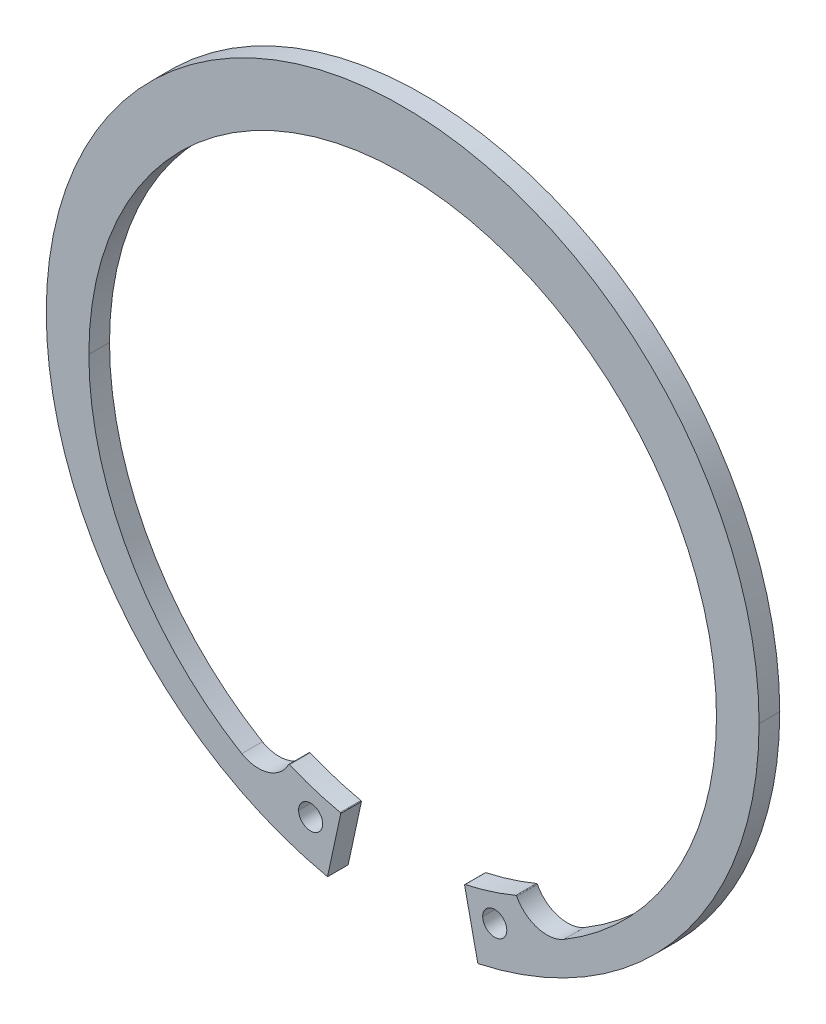
ISO-10303-21;
HEADER;
FILE_DESCRIPTION(('STEP AP214'),'2;1');
FILE_NAME('part.step','',(''),(''),'','','');
FILE_SCHEMA(('AUTOMOTIVE_DESIGN { 1 0 10303 214 1 1 1 1 }'));
ENDSEC;
DATA;
#1=APPLICATION_CONTEXT('core data for automotive mechanical design processes');
#2=APPLICATION_PROTOCOL_DEFINITION('international standard','automotive_design',2000,#1);
#3=PRODUCT_CONTEXT('',#1,'mechanical');
#4=PRODUCT('Part','Part','',(#3));
#5=PRODUCT_RELATED_PRODUCT_CATEGORY('part','',(#4));
#6=PRODUCT_DEFINITION_FORMATION('','',#4);
#7=PRODUCT_DEFINITION_CONTEXT('part definition',#1,'design');
#8=PRODUCT_DEFINITION('design','',#6,#7);
#9=PRODUCT_DEFINITION_SHAPE('','',#8);
#10=(LENGTH_UNIT() NAMED_UNIT(*) SI_UNIT(.MILLI.,.METRE.));
#11=(NAMED_UNIT(*) PLANE_ANGLE_UNIT() SI_UNIT($,.RADIAN.));
#12=(NAMED_UNIT(*) SI_UNIT($,.STERADIAN.) SOLID_ANGLE_UNIT());
#13=UNCERTAINTY_MEASURE_WITH_UNIT(LENGTH_MEASURE(1.E-05),#10,'distance_accuracy_value','');
#14=(GEOMETRIC_REPRESENTATION_CONTEXT(3) GLOBAL_UNCERTAINTY_ASSIGNED_CONTEXT((#13)) GLOBAL_UNIT_ASSIGNED_CONTEXT((#10,
#11,#12)) REPRESENTATION_CONTEXT('',''));
#15=CARTESIAN_POINT('',(0.,0.,0.));
#16=DIRECTION('',(0.,0.,1.));
#17=DIRECTION('',(1.,0.,0.));
#18=AXIS2_PLACEMENT_3D('',#15,#16,#17);
#19=CARTESIAN_POINT('',(-9.091747982708,-41.6696846474619,-3.));
#20=DIRECTION('',(0.,0.,1.));
#21=DIRECTION('',(1.,0.,0.));
#22=AXIS2_PLACEMENT_3D('',#19,#20,#21);
#23=CYLINDRICAL_SURFACE('',#22,0.100000000000005);
#24=DIRECTION('',(0.,0.,1.));
#25=VECTOR('',#24,1.);
#26=CARTESIAN_POINT('',(-8.99174798270799,-41.6696846474619,-3.));
#27=LINE('',#26,#25);
#28=CARTESIAN_POINT('',(-8.99174798270799,-41.6696846474619,-3.));
#29=VERTEX_POINT('',#28);
#30=CARTESIAN_POINT('',(-8.99174798270799,-41.6696846474619,0.));
#31=VERTEX_POINT('',#30);
#32=EDGE_CURVE('E289',#29,#31,#27,.T.);
#33=ORIENTED_EDGE('',*,*,#32,.F.);
#34=CARTESIAN_POINT('',(-9.091747982708,-41.6696846474619,-3.));
#35=DIRECTION('',(0.,0.,1.));
#36=DIRECTION('',(-1.,0.,0.));
#37=AXIS2_PLACEMENT_3D('',#34,#35,#36);
#38=CIRCLE('',#37,0.100000000000005);
#39=CARTESIAN_POINT('',(-9.07043087137691,-41.5719831594257,-3.));
#40=VERTEX_POINT('',#39);
#41=EDGE_CURVE('E321',#29,#40,#38,.T.);
#42=ORIENTED_EDGE('',*,*,#41,.T.);
#43=DIRECTION('',(0.,0.,1.));
#44=VECTOR('',#43,1.);
#45=CARTESIAN_POINT('',(-9.07043087137691,-41.5719831594257,-3.));
#46=LINE('',#45,#44);
#47=CARTESIAN_POINT('',(-9.07043087137691,-41.5719831594257,0.));
#48=VERTEX_POINT('',#47);
#49=EDGE_CURVE('E79',#40,#48,#46,.T.);
#50=ORIENTED_EDGE('',*,*,#49,.T.);
#51=CARTESIAN_POINT('',(-9.091747982708,-41.6696846474619,0.));
#52=DIRECTION('',(0.,0.,1.));
#53=DIRECTION('',(-1.,0.,0.));
#54=AXIS2_PLACEMENT_3D('',#51,#52,#53);
#55=CIRCLE('',#54,0.100000000000005);
#56=EDGE_CURVE('E273',#31,#48,#55,.T.);
#57=ORIENTED_EDGE('',*,*,#56,.F.);
#58=EDGE_LOOP('',(#33,#42,#50,#57));
#59=FACE_BOUND('',#58,.T.);
#60=ADVANCED_FACE('F17',(#59),#23,.T.);
#61=CARTESIAN_POINT('',(-16.4700937179461,-39.3415621566057,-3.));
#62=DIRECTION('',(0.,0.,1.));
#63=DIRECTION('',(1.,0.,0.));
#64=AXIS2_PLACEMENT_3D('',#61,#62,#63);
#65=CYLINDRICAL_SURFACE('',#64,0.100000000000024);
#66=CARTESIAN_POINT('',(-16.4700937179461,-39.3415621566057,0.));
#67=DIRECTION('',(0.,0.,1.));
#68=DIRECTION('',(1.,0.,0.));
#69=AXIS2_PLACEMENT_3D('',#66,#67,#68);
#70=CIRCLE('',#69,0.100000000000024);
#71=CARTESIAN_POINT('',(-16.431476851081,-39.2493193379502,0.));
#72=VERTEX_POINT('',#71);
#73=CARTESIAN_POINT('',(-16.5590059803512,-39.2957952515979,0.));
#74=VERTEX_POINT('',#73);
#75=EDGE_CURVE('E350',#72,#74,#70,.T.);
#76=ORIENTED_EDGE('',*,*,#75,.F.);
#77=DIRECTION('',(0.,0.,1.));
#78=VECTOR('',#77,1.);
#79=CARTESIAN_POINT('',(-16.431476851081,-39.2493193379502,-3.));
#80=LINE('',#79,#78);
#81=CARTESIAN_POINT('',(-16.431476851081,-39.2493193379502,-3.));
#82=VERTEX_POINT('',#81);
#83=EDGE_CURVE('E246',#82,#72,#80,.T.);
#84=ORIENTED_EDGE('',*,*,#83,.F.);
#85=CARTESIAN_POINT('',(-16.4700937179461,-39.3415621566057,-3.));
#86=DIRECTION('',(0.,0.,1.));
#87=DIRECTION('',(1.,0.,0.));
#88=AXIS2_PLACEMENT_3D('',#85,#86,#87);
#89=CIRCLE('',#88,0.100000000000024);
#90=CARTESIAN_POINT('',(-16.5590059803512,-39.2957952515979,-3.));
#91=VERTEX_POINT('',#90);
#92=EDGE_CURVE('E279',#82,#91,#89,.T.);
#93=ORIENTED_EDGE('',*,*,#92,.T.);
#94=DIRECTION('',(0.,0.,1.));
#95=VECTOR('',#94,1.);
#96=CARTESIAN_POINT('',(-16.5590059803512,-39.2957952515979,-3.));
#97=LINE('',#96,#95);
#98=EDGE_CURVE('E11',#91,#74,#97,.T.);
#99=ORIENTED_EDGE('',*,*,#98,.T.);
#100=EDGE_LOOP('',(#76,#84,#93,#99));
#101=FACE_BOUND('',#100,.T.);
#102=ADVANCED_FACE('F470',(#101),#65,.T.);
#103=CARTESIAN_POINT('',(-20.9412112612874,-37.0400887000845,-3.));
#104=DIRECTION('',(0.,0.,1.));
#105=DIRECTION('',(1.,0.,0.));
#106=AXIS2_PLACEMENT_3D('',#103,#104,#105);
#107=CYLINDRICAL_SURFACE('',#106,4.92868493320537);
#108=CARTESIAN_POINT('',(-20.9412112612874,-37.0400887000845,0.));
#109=DIRECTION('',(0.,0.,-1.));
#110=DIRECTION('',(1.,0.,0.));
#111=AXIS2_PLACEMENT_3D('',#108,#109,#110);
#112=CIRCLE('',#111,4.92868493320537);
#113=CARTESIAN_POINT('',(-23.3668900492212,-41.3305452711937,0.));
#114=VERTEX_POINT('',#113);
#115=EDGE_CURVE('E345',#74,#114,#112,.T.);
#116=ORIENTED_EDGE('',*,*,#115,.F.);
#117=ORIENTED_EDGE('',*,*,#98,.F.);
#118=CARTESIAN_POINT('',(-20.9412112612874,-37.0400887000845,-3.));
#119=DIRECTION('',(0.,0.,-1.));
#120=DIRECTION('',(1.,0.,0.));
#121=AXIS2_PLACEMENT_3D('',#118,#119,#120);
#122=CIRCLE('',#121,4.92868493320537);
#123=CARTESIAN_POINT('',(-23.3668900492212,-41.3305452711937,-3.));
#124=VERTEX_POINT('',#123);
#125=EDGE_CURVE('E283',#91,#124,#122,.T.);
#126=ORIENTED_EDGE('',*,*,#125,.T.);
#127=DIRECTION('',(0.,0.,1.));
#128=VECTOR('',#127,1.);
#129=CARTESIAN_POINT('',(-23.3668900492212,-41.3305452711937,-3.));
#130=LINE('',#129,#128);
#131=EDGE_CURVE('E28',#124,#114,#130,.T.);
#132=ORIENTED_EDGE('',*,*,#131,.T.);
#133=EDGE_LOOP('',(#116,#117,#126,#132));
#134=FACE_BOUND('',#133,.T.);
#135=ADVANCED_FACE('F480',(#134),#107,.F.);
#136=CARTESIAN_POINT('',(-25.4690407231875,-45.0487565271298,-3.));
#137=DIRECTION('',(-0.870507372504924,0.492155376293477,0.));
#138=DIRECTION('',(0.,0.,1.));
#139=AXIS2_PLACEMENT_3D('',#136,#137,#138);
#140=PLANE('',#139);
#141=DIRECTION('',(-0.492155376293477,-0.870507372504924,0.));
#142=VECTOR('',#141,1.);
#143=CARTESIAN_POINT('',(-25.4690407231875,-45.0487565271298,-3.));
#144=LINE('',#143,#142);
#145=CARTESIAN_POINT('',(-23.3676688865363,-41.3319228516437,-3.));
#146=VERTEX_POINT('',#145);
#147=EDGE_CURVE('E392',#124,#146,#144,.T.);
#148=ORIENTED_EDGE('',*,*,#147,.T.);
#149=DIRECTION('',(0.,0.,1.));
#150=VECTOR('',#149,1.);
#151=CARTESIAN_POINT('',(-23.3676688865363,-41.3319228516437,-3.));
#152=LINE('',#151,#150);
#153=CARTESIAN_POINT('',(-23.3676688865363,-41.3319228516437,0.));
#154=VERTEX_POINT('',#153);
#155=EDGE_CURVE('E254',#146,#154,#152,.T.);
#156=ORIENTED_EDGE('',*,*,#155,.T.);
#157=DIRECTION('',(-0.492155376293477,-0.870507372504924,0.));
#158=VECTOR('',#157,1.);
#159=CARTESIAN_POINT('',(-25.4690407231875,-45.0487565271298,0.));
#160=LINE('',#159,#158);
#161=EDGE_CURVE('E225',#114,#154,#160,.T.);
#162=ORIENTED_EDGE('',*,*,#161,.F.);
#163=ORIENTED_EDGE('',*,*,#131,.F.);
#164=EDGE_LOOP('',(#148,#156,#162,#163));
#165=FACE_BOUND('',#164,.T.);
#166=ADVANCED_FACE('F965',(#165),#140,.T.);
#167=CARTESIAN_POINT('',(0.,0.,-3.));
#168=DIRECTION('',(0.,0.,1.));
#169=DIRECTION('',(1.,0.,0.));
#170=AXIS2_PLACEMENT_3D('',#167,#168,#169);
#171=CYLINDRICAL_SURFACE('',#170,42.55);
#172=CARTESIAN_POINT('',(0.,0.,0.));
#173=DIRECTION('',(0.,0.,-1.));
#174=DIRECTION('',(1.,0.,0.));
#175=AXIS2_PLACEMENT_3D('',#172,#173,#174);
#176=CIRCLE('',#175,42.55);
#177=EDGE_CURVE('E277',#48,#72,#176,.T.);
#178=ORIENTED_EDGE('',*,*,#177,.F.);
#179=ORIENTED_EDGE('',*,*,#49,.F.);
#180=CARTESIAN_POINT('',(0.,0.,-3.));
#181=DIRECTION('',(0.,0.,-1.));
#182=DIRECTION('',(1.,0.,0.));
#183=AXIS2_PLACEMENT_3D('',#180,#181,#182);
#184=CIRCLE('',#183,42.55);
#185=EDGE_CURVE('E282',#40,#82,#184,.T.);
#186=ORIENTED_EDGE('',*,*,#185,.T.);
#187=ORIENTED_EDGE('',*,*,#83,.T.);
#188=EDGE_LOOP('',(#178,#179,#186,#187));
#189=FACE_BOUND('',#188,.T.);
#190=ADVANCED_FACE('F474',(#189),#171,.F.);
#191=CARTESIAN_POINT('',(23.3668900492212,-41.3305452711937,-3.));
#192=DIRECTION('',(0.870507372504924,0.492155376293477,0.));
#193=DIRECTION('',(0.,0.,-1.));
#194=AXIS2_PLACEMENT_3D('',#191,#192,#193);
#195=PLANE('',#194);
#196=DIRECTION('',(-0.492155376293477,0.870507372504924,0.));
#197=VECTOR('',#196,1.);
#198=CARTESIAN_POINT('',(23.3668900492212,-41.3305452711937,0.));
#199=LINE('',#198,#197);
#200=CARTESIAN_POINT('',(23.3676688865363,-41.3319228516437,0.));
#201=VERTEX_POINT('',#200);
#202=CARTESIAN_POINT('',(23.3668900492212,-41.3305452711937,0.));
#203=VERTEX_POINT('',#202);
#204=EDGE_CURVE('E202',#201,#203,#199,.T.);
#205=ORIENTED_EDGE('',*,*,#204,.F.);
#206=DIRECTION('',(0.,0.,-1.));
#207=VECTOR('',#206,1.);
#208=CARTESIAN_POINT('',(23.3676688865363,-41.3319228516437,-3.));
#209=LINE('',#208,#207);
#210=CARTESIAN_POINT('',(23.3676688865363,-41.3319228516437,-3.));
#211=VERTEX_POINT('',#210);
#212=EDGE_CURVE('E262',#201,#211,#209,.T.);
#213=ORIENTED_EDGE('',*,*,#212,.T.);
#214=DIRECTION('',(-0.492155376293477,0.870507372504924,0.));
#215=VECTOR('',#214,1.);
#216=CARTESIAN_POINT('',(23.3668900492212,-41.3305452711937,-3.));
#217=LINE('',#216,#215);
#218=CARTESIAN_POINT('',(23.3668900492212,-41.3305452711937,-3.));
#219=VERTEX_POINT('',#218);
#220=EDGE_CURVE('E204',#211,#219,#217,.T.);
#221=ORIENTED_EDGE('',*,*,#220,.T.);
#222=DIRECTION('',(0.,0.,1.));
#223=VECTOR('',#222,1.);
#224=CARTESIAN_POINT('',(23.3668900492212,-41.3305452711937,-3.));
#225=LINE('',#224,#223);
#226=EDGE_CURVE('E197',#219,#203,#225,.T.);
#227=ORIENTED_EDGE('',*,*,#226,.T.);
#228=EDGE_LOOP('',(#205,#213,#221,#227));
#229=FACE_BOUND('',#228,.T.);
#230=ADVANCED_FACE('F199',(#229),#195,.T.);
#231=CARTESIAN_POINT('',(20.9412112612874,-37.0400887000845,-3.));
#232=DIRECTION('',(0.,0.,1.));
#233=DIRECTION('',(1.,0.,0.));
#234=AXIS2_PLACEMENT_3D('',#231,#232,#233);
#235=CYLINDRICAL_SURFACE('',#234,4.92868493320537);
#236=CARTESIAN_POINT('',(20.9412112612874,-37.0400887000845,0.));
#237=DIRECTION('',(0.,0.,-1.));
#238=DIRECTION('',(1.,0.,0.));
#239=AXIS2_PLACEMENT_3D('',#236,#237,#238);
#240=CIRCLE('',#239,4.92868493320537);
#241=CARTESIAN_POINT('',(16.5590059803512,-39.2957952515979,0.));
#242=VERTEX_POINT('',#241);
#243=EDGE_CURVE('E212',#203,#242,#240,.T.);
#244=ORIENTED_EDGE('',*,*,#243,.F.);
#245=ORIENTED_EDGE('',*,*,#226,.F.);
#246=CARTESIAN_POINT('',(20.9412112612874,-37.0400887000845,-3.));
#247=DIRECTION('',(0.,0.,-1.));
#248=DIRECTION('',(1.,0.,0.));
#249=AXIS2_PLACEMENT_3D('',#246,#247,#248);
#250=CIRCLE('',#249,4.92868493320537);
#251=CARTESIAN_POINT('',(16.5590059803512,-39.2957952515979,-3.));
#252=VERTEX_POINT('',#251);
#253=EDGE_CURVE('E342',#219,#252,#250,.T.);
#254=ORIENTED_EDGE('',*,*,#253,.T.);
#255=DIRECTION('',(0.,0.,1.));
#256=VECTOR('',#255,1.);
#257=CARTESIAN_POINT('',(16.5590059803512,-39.2957952515979,-3.));
#258=LINE('',#257,#256);
#259=EDGE_CURVE('E209',#252,#242,#258,.T.);
#260=ORIENTED_EDGE('',*,*,#259,.T.);
#261=EDGE_LOOP('',(#244,#245,#254,#260));
#262=FACE_BOUND('',#261,.T.);
#263=ADVANCED_FACE('F213',(#262),#235,.F.);
#264=CARTESIAN_POINT('',(16.4700937179461,-39.3415621566057,-3.));
#265=DIRECTION('',(0.,0.,1.));
#266=DIRECTION('',(1.,0.,0.));
#267=AXIS2_PLACEMENT_3D('',#264,#265,#266);
#268=CYLINDRICAL_SURFACE('',#267,0.100000000000024);
#269=CARTESIAN_POINT('',(16.4700937179461,-39.3415621566057,0.));
#270=DIRECTION('',(0.,0.,1.));
#271=DIRECTION('',(-1.,0.,0.));
#272=AXIS2_PLACEMENT_3D('',#269,#270,#271);
#273=CIRCLE('',#272,0.100000000000024);
#274=CARTESIAN_POINT('',(16.431476851081,-39.2493193379502,0.));
#275=VERTEX_POINT('',#274);
#276=EDGE_CURVE('E218',#242,#275,#273,.T.);
#277=ORIENTED_EDGE('',*,*,#276,.F.);
#278=ORIENTED_EDGE('',*,*,#259,.F.);
#279=CARTESIAN_POINT('',(16.4700937179461,-39.3415621566057,-3.));
#280=DIRECTION('',(0.,0.,1.));
#281=DIRECTION('',(-1.,0.,0.));
#282=AXIS2_PLACEMENT_3D('',#279,#280,#281);
#283=CIRCLE('',#282,0.100000000000024);
#284=CARTESIAN_POINT('',(16.431476851081,-39.2493193379502,-3.));
#285=VERTEX_POINT('',#284);
#286=EDGE_CURVE('E369',#252,#285,#283,.T.);
#287=ORIENTED_EDGE('',*,*,#286,.T.);
#288=DIRECTION('',(0.,0.,1.));
#289=VECTOR('',#288,1.);
#290=CARTESIAN_POINT('',(16.431476851081,-39.2493193379502,-3.));
#291=LINE('',#290,#289);
#292=EDGE_CURVE('E241',#285,#275,#291,.T.);
#293=ORIENTED_EDGE('',*,*,#292,.T.);
#294=EDGE_LOOP('',(#277,#278,#287,#293));
#295=FACE_BOUND('',#294,.T.);
#296=ADVANCED_FACE('F512',(#295),#268,.T.);
#297=CARTESIAN_POINT('',(9.09174798270799,-41.6696846474619,-3.));
#298=DIRECTION('',(0.,0.,1.));
#299=DIRECTION('',(1.,0.,0.));
#300=AXIS2_PLACEMENT_3D('',#297,#298,#299);
#301=CYLINDRICAL_SURFACE('',#300,0.100000000000005);
#302=CARTESIAN_POINT('',(9.09174798270799,-41.6696846474619,0.));
#303=DIRECTION('',(0.,0.,1.));
#304=DIRECTION('',(1.,0.,0.));
#305=AXIS2_PLACEMENT_3D('',#302,#303,#304);
#306=CIRCLE('',#305,0.100000000000005);
#307=CARTESIAN_POINT('',(9.07043087137691,-41.5719831594257,0.));
#308=VERTEX_POINT('',#307);
#309=CARTESIAN_POINT('',(8.99399678172332,-41.6907726228521,0.));
#310=VERTEX_POINT('',#309);
#311=EDGE_CURVE('E278',#308,#310,#306,.T.);
#312=ORIENTED_EDGE('',*,*,#311,.F.);
#313=DIRECTION('',(0.,0.,1.));
#314=VECTOR('',#313,1.);
#315=CARTESIAN_POINT('',(9.07043087137691,-41.5719831594257,-3.));
#316=LINE('',#315,#314);
#317=CARTESIAN_POINT('',(9.07043087137691,-41.5719831594257,-3.));
#318=VERTEX_POINT('',#317);
#319=EDGE_CURVE('E61',#318,#308,#316,.T.);
#320=ORIENTED_EDGE('',*,*,#319,.F.);
#321=CARTESIAN_POINT('',(9.09174798270799,-41.6696846474619,-3.));
#322=DIRECTION('',(0.,0.,1.));
#323=DIRECTION('',(1.,0.,0.));
#324=AXIS2_PLACEMENT_3D('',#321,#322,#323);
#325=CIRCLE('',#324,0.100000000000005);
#326=CARTESIAN_POINT('',(8.99399678172332,-41.6907726228521,-3.));
#327=VERTEX_POINT('',#326);
#328=EDGE_CURVE('E322',#318,#327,#325,.T.);
#329=ORIENTED_EDGE('',*,*,#328,.T.);
#330=DIRECTION('',(0.,0.,1.));
#331=VECTOR('',#330,1.);
#332=CARTESIAN_POINT('',(8.99399678172332,-41.6907726228521,-3.));
#333=LINE('',#332,#331);
#334=EDGE_CURVE('E266',#327,#310,#333,.T.);
#335=ORIENTED_EDGE('',*,*,#334,.T.);
#336=EDGE_LOOP('',(#312,#320,#329,#335));
#337=FACE_BOUND('',#336,.T.);
#338=ADVANCED_FACE('F519',(#337),#301,.T.);
#339=CARTESIAN_POINT('',(0.,0.,-3.));
#340=DIRECTION('',(0.,0.,1.));
#341=DIRECTION('',(1.,0.,0.));
#342=AXIS2_PLACEMENT_3D('',#339,#340,#341);
#343=CYLINDRICAL_SURFACE('',#342,42.55);
#344=CARTESIAN_POINT('',(0.,0.,0.));
#345=DIRECTION('',(0.,0.,-1.));
#346=DIRECTION('',(1.,0.,0.));
#347=AXIS2_PLACEMENT_3D('',#344,#345,#346);
#348=CIRCLE('',#347,42.55);
#349=EDGE_CURVE('E328',#275,#308,#348,.T.);
#350=ORIENTED_EDGE('',*,*,#349,.F.);
#351=ORIENTED_EDGE('',*,*,#292,.F.);
#352=CARTESIAN_POINT('',(0.,0.,-3.));
#353=DIRECTION('',(0.,0.,-1.));
#354=DIRECTION('',(1.,0.,0.));
#355=AXIS2_PLACEMENT_3D('',#352,#353,#354);
#356=CIRCLE('',#355,42.55);
#357=EDGE_CURVE('E325',#285,#318,#356,.T.);
#358=ORIENTED_EDGE('',*,*,#357,.T.);
#359=ORIENTED_EDGE('',*,*,#319,.T.);
#360=EDGE_LOOP('',(#350,#351,#358,#359));
#361=FACE_BOUND('',#360,.T.);
#362=ADVANCED_FACE('F516',(#361),#343,.F.);
#363=CARTESIAN_POINT('',(-13.3680251671901,-44.3020488028417,-3.));
#364=DIRECTION('',(0.,0.,1.));
#365=DIRECTION('',(1.,0.,0.));
#366=AXIS2_PLACEMENT_3D('',#363,#364,#365);
#367=CYLINDRICAL_SURFACE('',#366,1.75);
#368=DIRECTION('',(0.,0.,1.));
#369=VECTOR('',#368,1.);
#370=CARTESIAN_POINT('',(-15.1180251671901,-44.3020488028417,-3.));
#371=LINE('',#370,#369);
#372=CARTESIAN_POINT('',(-15.1180251671901,-44.3020488028417,-3.));
#373=VERTEX_POINT('',#372);
#374=CARTESIAN_POINT('',(-15.1180251671901,-44.3020488028417,0.));
#375=VERTEX_POINT('',#374);
#376=EDGE_CURVE('E332',#373,#375,#371,.T.);
#377=ORIENTED_EDGE('',*,*,#376,.F.);
#378=CARTESIAN_POINT('',(-13.3680251671901,-44.3020488028417,-3.));
#379=DIRECTION('',(0.,0.,1.));
#380=DIRECTION('',(1.,0.,0.));
#381=AXIS2_PLACEMENT_3D('',#378,#379,#380);
#382=CIRCLE('',#381,1.75);
#383=CARTESIAN_POINT('',(-11.6180251671901,-44.3020488028417,-3.));
#384=VERTEX_POINT('',#383);
#385=EDGE_CURVE('E231',#384,#373,#382,.T.);
#386=ORIENTED_EDGE('',*,*,#385,.F.);
#387=DIRECTION('',(0.,0.,1.));
#388=VECTOR('',#387,1.);
#389=CARTESIAN_POINT('',(-11.6180251671901,-44.3020488028417,-3.));
#390=LINE('',#389,#388);
#391=CARTESIAN_POINT('',(-11.6180251671901,-44.3020488028417,0.));
#392=VERTEX_POINT('',#391);
#393=EDGE_CURVE('E351',#384,#392,#390,.T.);
#394=ORIENTED_EDGE('',*,*,#393,.T.);
#395=CARTESIAN_POINT('',(-13.3680251671901,-44.3020488028417,0.));
#396=DIRECTION('',(0.,0.,1.));
#397=DIRECTION('',(1.,0.,0.));
#398=AXIS2_PLACEMENT_3D('',#395,#396,#397);
#399=CIRCLE('',#398,1.75);
#400=EDGE_CURVE('E245',#392,#375,#399,.T.);
#401=ORIENTED_EDGE('',*,*,#400,.T.);
#402=EDGE_LOOP('',(#377,#386,#394,#401));
#403=FACE_BOUND('',#402,.T.);
#404=ADVANCED_FACE('F988',(#403),#367,.F.);
#405=CARTESIAN_POINT('',(13.3680251671901,-44.3020488028417,-3.));
#406=DIRECTION('',(0.,0.,1.));
#407=DIRECTION('',(1.,0.,0.));
#408=AXIS2_PLACEMENT_3D('',#405,#406,#407);
#409=CYLINDRICAL_SURFACE('',#408,1.75);
#410=DIRECTION('',(0.,0.,1.));
#411=VECTOR('',#410,1.);
#412=CARTESIAN_POINT('',(11.6180251671901,-44.3020488028417,-3.));
#413=LINE('',#412,#411);
#414=CARTESIAN_POINT('',(11.6180251671901,-44.3020488028417,-3.));
#415=VERTEX_POINT('',#414);
#416=CARTESIAN_POINT('',(11.6180251671901,-44.3020488028417,0.));
#417=VERTEX_POINT('',#416);
#418=EDGE_CURVE('E407',#415,#417,#413,.T.);
#419=ORIENTED_EDGE('',*,*,#418,.F.);
#420=CARTESIAN_POINT('',(13.3680251671901,-44.3020488028417,-3.));
#421=DIRECTION('',(0.,0.,1.));
#422=DIRECTION('',(1.,0.,0.));
#423=AXIS2_PLACEMENT_3D('',#420,#421,#422);
#424=CIRCLE('',#423,1.75);
#425=CARTESIAN_POINT('',(15.1180251671901,-44.3020488028417,-3.));
#426=VERTEX_POINT('',#425);
#427=EDGE_CURVE('E257',#426,#415,#424,.T.);
#428=ORIENTED_EDGE('',*,*,#427,.F.);
#429=DIRECTION('',(0.,0.,1.));
#430=VECTOR('',#429,1.);
#431=CARTESIAN_POINT('',(15.1180251671901,-44.3020488028417,-3.));
#432=LINE('',#431,#430);
#433=CARTESIAN_POINT('',(15.1180251671901,-44.3020488028417,0.));
#434=VERTEX_POINT('',#433);
#435=EDGE_CURVE('E387',#426,#434,#432,.T.);
#436=ORIENTED_EDGE('',*,*,#435,.T.);
#437=CARTESIAN_POINT('',(13.3680251671901,-44.3020488028417,0.));
#438=DIRECTION('',(0.,0.,1.));
#439=DIRECTION('',(1.,0.,0.));
#440=AXIS2_PLACEMENT_3D('',#437,#438,#439);
#441=CIRCLE('',#440,1.75);
#442=EDGE_CURVE('E349',#434,#417,#441,.T.);
#443=ORIENTED_EDGE('',*,*,#442,.T.);
#444=EDGE_LOOP('',(#419,#428,#436,#443));
#445=FACE_BOUND('',#444,.T.);
#446=ADVANCED_FACE('F944',(#445),#409,.F.);
#447=CARTESIAN_POINT('',(0.,0.,0.));
#448=DIRECTION('',(0.,0.,1.));
#449=DIRECTION('',(1.,0.,0.));
#450=AXIS2_PLACEMENT_3D('',#447,#448,#449);
#451=PLANE('',#450);
#452=ORIENTED_EDGE('',*,*,#400,.F.);
#453=CARTESIAN_POINT('',(-13.3680251671901,-44.3020488028417,0.));
#454=DIRECTION('',(0.,0.,1.));
#455=DIRECTION('',(1.,0.,0.));
#456=AXIS2_PLACEMENT_3D('',#453,#454,#455);
#457=CIRCLE('',#456,1.75);
#458=EDGE_CURVE('E336',#375,#392,#457,.T.);
#459=ORIENTED_EDGE('',*,*,#458,.F.);
#460=EDGE_LOOP('',(#452,#459));
#461=FACE_BOUND('',#460,.T.);
#462=ORIENTED_EDGE('',*,*,#442,.F.);
#463=CARTESIAN_POINT('',(13.3680251671901,-44.3020488028417,0.));
#464=DIRECTION('',(0.,0.,1.));
#465=DIRECTION('',(1.,0.,0.));
#466=AXIS2_PLACEMENT_3D('',#463,#464,#465);
#467=CIRCLE('',#466,1.75);
#468=EDGE_CURVE('E403',#417,#434,#467,.T.);
#469=ORIENTED_EDGE('',*,*,#468,.F.);
#470=EDGE_LOOP('',(#462,#469));
#471=FACE_BOUND('',#470,.T.);
#472=ORIENTED_EDGE('',*,*,#161,.T.);
#473=CARTESIAN_POINT('',(0.,-2.2150730827302,0.));
#474=DIRECTION('',(0.,0.,-1.));
#475=DIRECTION('',(1.,0.,0.));
#476=AXIS2_PLACEMENT_3D('',#473,#474,#475);
#477=CIRCLE('',#476,45.5650730827302);
#478=CARTESIAN_POINT('',(-45.5650730827302,-2.21507308273019,0.));
#479=VERTEX_POINT('',#478);
#480=EDGE_CURVE('E271',#154,#479,#477,.T.);
#481=ORIENTED_EDGE('',*,*,#480,.T.);
#482=CARTESIAN_POINT('',(0.,-2.2150730827302,0.));
#483=DIRECTION('',(0.,0.,-1.));
#484=DIRECTION('',(1.,0.,0.));
#485=AXIS2_PLACEMENT_3D('',#482,#483,#484);
#486=CIRCLE('',#485,45.5650730827302);
#487=CARTESIAN_POINT('',(45.5650730827302,-2.2150730827302,0.));
#488=VERTEX_POINT('',#487);
#489=EDGE_CURVE('E21',#479,#488,#486,.T.);
#490=ORIENTED_EDGE('',*,*,#489,.T.);
#491=CARTESIAN_POINT('',(0.,-2.2150730827302,0.));
#492=DIRECTION('',(0.,0.,-1.));
#493=DIRECTION('',(1.,0.,0.));
#494=AXIS2_PLACEMENT_3D('',#491,#492,#493);
#495=CIRCLE('',#494,45.5650730827302);
#496=EDGE_CURVE('E222',#488,#201,#495,.T.);
#497=ORIENTED_EDGE('',*,*,#496,.T.);
#498=ORIENTED_EDGE('',*,*,#204,.T.);
#499=ORIENTED_EDGE('',*,*,#243,.T.);
#500=ORIENTED_EDGE('',*,*,#276,.T.);
#501=ORIENTED_EDGE('',*,*,#349,.T.);
#502=ORIENTED_EDGE('',*,*,#311,.T.);
#503=DIRECTION('',(0.210879753901185,-0.977512009846721,0.));
#504=VECTOR('',#503,1.);
#505=CARTESIAN_POINT('',(10.9130272643863,-50.5862465095678,0.));
#506=LINE('',#505,#504);
#507=CARTESIAN_POINT('',(10.9130272643863,-50.5862465095678,0.));
#508=VERTEX_POINT('',#507);
#509=EDGE_CURVE('E293',#310,#508,#506,.T.);
#510=ORIENTED_EDGE('',*,*,#509,.T.);
#511=CARTESIAN_POINT('',(0.,0.,0.));
#512=DIRECTION('',(0.,0.,1.));
#513=DIRECTION('',(1.,0.,0.));
#514=AXIS2_PLACEMENT_3D('',#511,#512,#513);
#515=CIRCLE('',#514,51.75);
#516=CARTESIAN_POINT('',(51.75,0.,0.));
#517=VERTEX_POINT('',#516);
#518=EDGE_CURVE('E239',#508,#517,#515,.T.);
#519=ORIENTED_EDGE('',*,*,#518,.T.);
#520=CARTESIAN_POINT('',(0.,0.,0.));
#521=DIRECTION('',(0.,0.,1.));
#522=DIRECTION('',(1.,0.,0.));
#523=AXIS2_PLACEMENT_3D('',#520,#521,#522);
#524=CIRCLE('',#523,51.75);
#525=CARTESIAN_POINT('',(-51.75,0.,0.));
#526=VERTEX_POINT('',#525);
#527=EDGE_CURVE('E379',#517,#526,#524,.T.);
#528=ORIENTED_EDGE('',*,*,#527,.T.);
#529=CARTESIAN_POINT('',(0.,0.,0.));
#530=DIRECTION('',(0.,0.,1.));
#531=DIRECTION('',(1.,0.,0.));
#532=AXIS2_PLACEMENT_3D('',#529,#530,#531);
#533=CIRCLE('',#532,51.75);
#534=CARTESIAN_POINT('',(-10.9130272643863,-50.5862465095678,0.));
#535=VERTEX_POINT('',#534);
#536=EDGE_CURVE('E294',#526,#535,#533,.T.);
#537=ORIENTED_EDGE('',*,*,#536,.T.);
#538=DIRECTION('',(0.210879753901185,0.977512009846721,0.));
#539=VECTOR('',#538,1.);
#540=CARTESIAN_POINT('',(-10.9130272643863,-50.5862465095678,0.));
#541=LINE('',#540,#539);
#542=CARTESIAN_POINT('',(-8.99399678172332,-41.6907726228521,0.));
#543=VERTEX_POINT('',#542);
#544=EDGE_CURVE('E393',#535,#543,#541,.T.);
#545=ORIENTED_EDGE('',*,*,#544,.T.);
#546=CARTESIAN_POINT('',(-9.091747982708,-41.6696846474619,0.));
#547=DIRECTION('',(0.,0.,1.));
#548=DIRECTION('',(-1.,0.,0.));
#549=AXIS2_PLACEMENT_3D('',#546,#547,#548);
#550=CIRCLE('',#549,0.100000000000005);
#551=EDGE_CURVE('E284',#543,#31,#550,.T.);
#552=ORIENTED_EDGE('',*,*,#551,.T.);
#553=ORIENTED_EDGE('',*,*,#56,.T.);
#554=ORIENTED_EDGE('',*,*,#177,.T.);
#555=ORIENTED_EDGE('',*,*,#75,.T.);
#556=ORIENTED_EDGE('',*,*,#115,.T.);
#557=EDGE_LOOP('',(#472,#481,#490,#497,#498,#499,#500,#501,#502,#510,#519,#528,#537,#545,#552,
#553,#554,#555,#556));
#558=FACE_BOUND('',#557,.T.);
#559=ADVANCED_FACE('F220',(#461,#471,#558),#451,.T.);
#560=CARTESIAN_POINT('',(0.,0.,-3.));
#561=DIRECTION('',(0.,0.,1.));
#562=DIRECTION('',(1.,0.,0.));
#563=AXIS2_PLACEMENT_3D('',#560,#561,#562);
#564=PLANE('',#563);
#565=ORIENTED_EDGE('',*,*,#385,.T.);
#566=CARTESIAN_POINT('',(-13.3680251671901,-44.3020488028417,-3.));
#567=DIRECTION('',(0.,0.,1.));
#568=DIRECTION('',(1.,0.,0.));
#569=AXIS2_PLACEMENT_3D('',#566,#567,#568);
#570=CIRCLE('',#569,1.75);
#571=EDGE_CURVE('E337',#373,#384,#570,.T.);
#572=ORIENTED_EDGE('',*,*,#571,.T.);
#573=EDGE_LOOP('',(#565,#572));
#574=FACE_BOUND('',#573,.T.);
#575=ORIENTED_EDGE('',*,*,#427,.T.);
#576=CARTESIAN_POINT('',(13.3680251671901,-44.3020488028417,-3.));
#577=DIRECTION('',(0.,0.,1.));
#578=DIRECTION('',(1.,0.,0.));
#579=AXIS2_PLACEMENT_3D('',#576,#577,#578);
#580=CIRCLE('',#579,1.75);
#581=EDGE_CURVE('E355',#415,#426,#580,.T.);
#582=ORIENTED_EDGE('',*,*,#581,.T.);
#583=EDGE_LOOP('',(#575,#582));
#584=FACE_BOUND('',#583,.T.);
#585=CARTESIAN_POINT('',(0.,-2.2150730827302,-3.));
#586=DIRECTION('',(0.,0.,-1.));
#587=DIRECTION('',(1.,0.,0.));
#588=AXIS2_PLACEMENT_3D('',#585,#586,#587);
#589=CIRCLE('',#588,45.5650730827302);
#590=CARTESIAN_POINT('',(-45.5650730827302,-2.21507308273019,-3.));
#591=VERTEX_POINT('',#590);
#592=EDGE_CURVE('E272',#146,#591,#589,.T.);
#593=ORIENTED_EDGE('',*,*,#592,.F.);
#594=ORIENTED_EDGE('',*,*,#147,.F.);
#595=ORIENTED_EDGE('',*,*,#125,.F.);
#596=ORIENTED_EDGE('',*,*,#92,.F.);
#597=ORIENTED_EDGE('',*,*,#185,.F.);
#598=ORIENTED_EDGE('',*,*,#41,.F.);
#599=CARTESIAN_POINT('',(-9.091747982708,-41.6696846474619,-3.));
#600=DIRECTION('',(0.,0.,1.));
#601=DIRECTION('',(-1.,0.,0.));
#602=AXIS2_PLACEMENT_3D('',#599,#600,#601);
#603=CIRCLE('',#602,0.100000000000005);
#604=CARTESIAN_POINT('',(-8.99399678172332,-41.6907726228521,-3.));
#605=VERTEX_POINT('',#604);
#606=EDGE_CURVE('E411',#605,#29,#603,.T.);
#607=ORIENTED_EDGE('',*,*,#606,.F.);
#608=DIRECTION('',(0.210879753901185,0.977512009846721,0.));
#609=VECTOR('',#608,1.);
#610=CARTESIAN_POINT('',(-10.9130272643863,-50.5862465095678,-3.));
#611=LINE('',#610,#609);
#612=CARTESIAN_POINT('',(-10.9130272643863,-50.5862465095678,-3.));
#613=VERTEX_POINT('',#612);
#614=EDGE_CURVE('E388',#613,#605,#611,.T.);
#615=ORIENTED_EDGE('',*,*,#614,.F.);
#616=CARTESIAN_POINT('',(0.,0.,-3.));
#617=DIRECTION('',(0.,0.,1.));
#618=DIRECTION('',(1.,0.,0.));
#619=AXIS2_PLACEMENT_3D('',#616,#617,#618);
#620=CIRCLE('',#619,51.75);
#621=CARTESIAN_POINT('',(-51.75,0.,-3.));
#622=VERTEX_POINT('',#621);
#623=EDGE_CURVE('E307',#622,#613,#620,.T.);
#624=ORIENTED_EDGE('',*,*,#623,.F.);
#625=CARTESIAN_POINT('',(0.,0.,-3.));
#626=DIRECTION('',(0.,0.,1.));
#627=DIRECTION('',(1.,0.,0.));
#628=AXIS2_PLACEMENT_3D('',#625,#626,#627);
#629=CIRCLE('',#628,51.75);
#630=CARTESIAN_POINT('',(51.75,0.,-3.));
#631=VERTEX_POINT('',#630);
#632=EDGE_CURVE('E396',#631,#622,#629,.T.);
#633=ORIENTED_EDGE('',*,*,#632,.F.);
#634=CARTESIAN_POINT('',(0.,0.,-3.));
#635=DIRECTION('',(0.,0.,1.));
#636=DIRECTION('',(1.,0.,0.));
#637=AXIS2_PLACEMENT_3D('',#634,#635,#636);
#638=CIRCLE('',#637,51.75);
#639=CARTESIAN_POINT('',(10.9130272643863,-50.5862465095678,-3.));
#640=VERTEX_POINT('',#639);
#641=EDGE_CURVE('E236',#640,#631,#638,.T.);
#642=ORIENTED_EDGE('',*,*,#641,.F.);
#643=DIRECTION('',(0.210879753901185,-0.977512009846721,0.));
#644=VECTOR('',#643,1.);
#645=CARTESIAN_POINT('',(10.9130272643863,-50.5862465095678,-3.));
#646=LINE('',#645,#644);
#647=EDGE_CURVE('E263',#327,#640,#646,.T.);
#648=ORIENTED_EDGE('',*,*,#647,.F.);
#649=ORIENTED_EDGE('',*,*,#328,.F.);
#650=ORIENTED_EDGE('',*,*,#357,.F.);
#651=ORIENTED_EDGE('',*,*,#286,.F.);
#652=ORIENTED_EDGE('',*,*,#253,.F.);
#653=ORIENTED_EDGE('',*,*,#220,.F.);
#654=CARTESIAN_POINT('',(0.,-2.2150730827302,-3.));
#655=DIRECTION('',(0.,0.,-1.));
#656=DIRECTION('',(1.,0.,0.));
#657=AXIS2_PLACEMENT_3D('',#654,#655,#656);
#658=CIRCLE('',#657,45.5650730827302);
#659=CARTESIAN_POINT('',(45.5650730827302,-2.2150730827302,-3.));
#660=VERTEX_POINT('',#659);
#661=EDGE_CURVE('E258',#660,#211,#658,.T.);
#662=ORIENTED_EDGE('',*,*,#661,.F.);
#663=CARTESIAN_POINT('',(0.,-2.2150730827302,-3.));
#664=DIRECTION('',(0.,0.,-1.));
#665=DIRECTION('',(1.,0.,0.));
#666=AXIS2_PLACEMENT_3D('',#663,#664,#665);
#667=CIRCLE('',#666,45.5650730827302);
#668=EDGE_CURVE('E249',#591,#660,#667,.T.);
#669=ORIENTED_EDGE('',*,*,#668,.F.);
#670=EDGE_LOOP('',(#593,#594,#595,#596,#597,#598,#607,#615,#624,#633,#642,#648,#649,#650,#651,
#652,#653,#662,#669));
#671=FACE_BOUND('',#670,.T.);
#672=ADVANCED_FACE('F477',(#574,#584,#671),#564,.F.);
#673=CARTESIAN_POINT('',(-10.9130272643863,-50.5862465095678,-3.));
#674=DIRECTION('',(0.977512009846721,-0.210879753901185,0.));
#675=DIRECTION('',(0.,0.,-1.));
#676=AXIS2_PLACEMENT_3D('',#673,#674,#675);
#677=PLANE('',#676);
#678=ORIENTED_EDGE('',*,*,#544,.F.);
#679=DIRECTION('',(0.,0.,1.));
#680=VECTOR('',#679,1.);
#681=CARTESIAN_POINT('',(-10.9130272643863,-50.5862465095678,-3.));
#682=LINE('',#681,#680);
#683=EDGE_CURVE('E297',#613,#535,#682,.T.);
#684=ORIENTED_EDGE('',*,*,#683,.F.);
#685=ORIENTED_EDGE('',*,*,#614,.T.);
#686=DIRECTION('',(0.,0.,1.));
#687=VECTOR('',#686,1.);
#688=CARTESIAN_POINT('',(-8.99399678172332,-41.6907726228521,-3.));
#689=LINE('',#688,#687);
#690=EDGE_CURVE('E288',#605,#543,#689,.T.);
#691=ORIENTED_EDGE('',*,*,#690,.T.);
#692=EDGE_LOOP('',(#678,#684,#685,#691));
#693=FACE_BOUND('',#692,.T.);
#694=ADVANCED_FACE('F926',(#693),#677,.T.);
#695=CARTESIAN_POINT('',(0.,-2.2150730827302,-3.));
#696=DIRECTION('',(0.,0.,1.));
#697=DIRECTION('',(1.,0.,0.));
#698=AXIS2_PLACEMENT_3D('',#695,#696,#697);
#699=CYLINDRICAL_SURFACE('',#698,45.5650730827302);
#700=DIRECTION('',(0.,0.,1.));
#701=VECTOR('',#700,1.);
#702=CARTESIAN_POINT('',(45.5650730827302,-2.2150730827302,-3.));
#703=LINE('',#702,#701);
#704=EDGE_CURVE('E253',#660,#488,#703,.T.);
#705=ORIENTED_EDGE('',*,*,#704,.F.);
#706=ORIENTED_EDGE('',*,*,#661,.T.);
#707=ORIENTED_EDGE('',*,*,#212,.F.);
#708=ORIENTED_EDGE('',*,*,#496,.F.);
#709=EDGE_LOOP('',(#705,#706,#707,#708));
#710=FACE_BOUND('',#709,.T.);
#711=ADVANCED_FACE('F894',(#710),#699,.F.);
#712=CARTESIAN_POINT('',(10.9130272643863,-50.5862465095678,-3.));
#713=DIRECTION('',(-0.977512009846721,-0.210879753901185,0.));
#714=DIRECTION('',(-0.210879753901185,0.977512009846721,0.));
#715=AXIS2_PLACEMENT_3D('',#712,#713,#714);
#716=PLANE('',#715);
#717=ORIENTED_EDGE('',*,*,#509,.F.);
#718=ORIENTED_EDGE('',*,*,#334,.F.);
#719=ORIENTED_EDGE('',*,*,#647,.T.);
#720=DIRECTION('',(0.,0.,1.));
#721=VECTOR('',#720,1.);
#722=CARTESIAN_POINT('',(10.9130272643863,-50.5862465095678,-3.));
#723=LINE('',#722,#721);
#724=EDGE_CURVE('E315',#640,#508,#723,.T.);
#725=ORIENTED_EDGE('',*,*,#724,.T.);
#726=EDGE_LOOP('',(#717,#718,#719,#725));
#727=FACE_BOUND('',#726,.T.);
#728=ADVANCED_FACE('F523',(#727),#716,.T.);
#729=CARTESIAN_POINT('',(0.,0.,-3.));
#730=DIRECTION('',(0.,0.,1.));
#731=DIRECTION('',(1.,0.,0.));
#732=AXIS2_PLACEMENT_3D('',#729,#730,#731);
#733=CYLINDRICAL_SURFACE('',#732,51.75);
#734=DIRECTION('',(0.,0.,1.));
#735=VECTOR('',#734,1.);
#736=CARTESIAN_POINT('',(-51.75,0.,-3.));
#737=LINE('',#736,#735);
#738=EDGE_CURVE('E234',#622,#526,#737,.T.);
#739=ORIENTED_EDGE('',*,*,#738,.F.);
#740=ORIENTED_EDGE('',*,*,#623,.T.);
#741=ORIENTED_EDGE('',*,*,#683,.T.);
#742=ORIENTED_EDGE('',*,*,#536,.F.);
#743=EDGE_LOOP('',(#739,#740,#741,#742));
#744=FACE_BOUND('',#743,.T.);
#745=ADVANCED_FACE('F19',(#744),#733,.T.);
#746=CARTESIAN_POINT('',(0.,0.,-3.));
#747=DIRECTION('',(0.,0.,1.));
#748=DIRECTION('',(1.,0.,0.));
#749=AXIS2_PLACEMENT_3D('',#746,#747,#748);
#750=CYLINDRICAL_SURFACE('',#749,51.75);
#751=ORIENTED_EDGE('',*,*,#641,.T.);
#752=DIRECTION('',(0.,0.,1.));
#753=VECTOR('',#752,1.);
#754=CARTESIAN_POINT('',(51.75,0.,-3.));
#755=LINE('',#754,#753);
#756=EDGE_CURVE('E240',#631,#517,#755,.T.);
#757=ORIENTED_EDGE('',*,*,#756,.T.);
#758=ORIENTED_EDGE('',*,*,#518,.F.);
#759=ORIENTED_EDGE('',*,*,#724,.F.);
#760=EDGE_LOOP('',(#751,#757,#758,#759));
#761=FACE_BOUND('',#760,.T.);
#762=ADVANCED_FACE('F530',(#761),#750,.T.);
#763=CARTESIAN_POINT('',(0.,0.,-3.));
#764=DIRECTION('',(0.,0.,1.));
#765=DIRECTION('',(1.,0.,0.));
#766=AXIS2_PLACEMENT_3D('',#763,#764,#765);
#767=CYLINDRICAL_SURFACE('',#766,51.75);
#768=ORIENTED_EDGE('',*,*,#632,.T.);
#769=ORIENTED_EDGE('',*,*,#738,.T.);
#770=ORIENTED_EDGE('',*,*,#527,.F.);
#771=ORIENTED_EDGE('',*,*,#756,.F.);
#772=EDGE_LOOP('',(#768,#769,#770,#771));
#773=FACE_BOUND('',#772,.T.);
#774=ADVANCED_FACE('F536',(#773),#767,.T.);
#775=CARTESIAN_POINT('',(0.,-2.2150730827302,-3.));
#776=DIRECTION('',(0.,0.,1.));
#777=DIRECTION('',(1.,0.,0.));
#778=AXIS2_PLACEMENT_3D('',#775,#776,#777);
#779=CYLINDRICAL_SURFACE('',#778,45.5650730827302);
#780=DIRECTION('',(0.,0.,1.));
#781=VECTOR('',#780,1.);
#782=CARTESIAN_POINT('',(-45.5650730827302,-2.21507308273019,-3.));
#783=LINE('',#782,#781);
#784=EDGE_CURVE('E267',#591,#479,#783,.T.);
#785=ORIENTED_EDGE('',*,*,#784,.F.);
#786=ORIENTED_EDGE('',*,*,#668,.T.);
#787=ORIENTED_EDGE('',*,*,#704,.T.);
#788=ORIENTED_EDGE('',*,*,#489,.F.);
#789=EDGE_LOOP('',(#785,#786,#787,#788));
#790=FACE_BOUND('',#789,.T.);
#791=ADVANCED_FACE('F902',(#790),#779,.F.);
#792=CARTESIAN_POINT('',(0.,-2.2150730827302,-3.));
#793=DIRECTION('',(0.,0.,1.));
#794=DIRECTION('',(1.,0.,0.));
#795=AXIS2_PLACEMENT_3D('',#792,#793,#794);
#796=CYLINDRICAL_SURFACE('',#795,45.5650730827302);
#797=ORIENTED_EDGE('',*,*,#592,.T.);
#798=ORIENTED_EDGE('',*,*,#784,.T.);
#799=ORIENTED_EDGE('',*,*,#480,.F.);
#800=ORIENTED_EDGE('',*,*,#155,.F.);
#801=EDGE_LOOP('',(#797,#798,#799,#800));
#802=FACE_BOUND('',#801,.T.);
#803=ADVANCED_FACE('F917',(#802),#796,.F.);
#804=CARTESIAN_POINT('',(13.3680251671901,-44.3020488028417,-3.));
#805=DIRECTION('',(0.,0.,1.));
#806=DIRECTION('',(1.,0.,0.));
#807=AXIS2_PLACEMENT_3D('',#804,#805,#806);
#808=CYLINDRICAL_SURFACE('',#807,1.75);
#809=ORIENTED_EDGE('',*,*,#581,.F.);
#810=ORIENTED_EDGE('',*,*,#418,.T.);
#811=ORIENTED_EDGE('',*,*,#468,.T.);
#812=ORIENTED_EDGE('',*,*,#435,.F.);
#813=EDGE_LOOP('',(#809,#810,#811,#812));
#814=FACE_BOUND('',#813,.T.);
#815=ADVANCED_FACE('F932',(#814),#808,.F.);
#816=CARTESIAN_POINT('',(-13.3680251671901,-44.3020488028417,-3.));
#817=DIRECTION('',(0.,0.,1.));
#818=DIRECTION('',(1.,0.,0.));
#819=AXIS2_PLACEMENT_3D('',#816,#817,#818);
#820=CYLINDRICAL_SURFACE('',#819,1.75);
#821=ORIENTED_EDGE('',*,*,#571,.F.);
#822=ORIENTED_EDGE('',*,*,#376,.T.);
#823=ORIENTED_EDGE('',*,*,#458,.T.);
#824=ORIENTED_EDGE('',*,*,#393,.F.);
#825=EDGE_LOOP('',(#821,#822,#823,#824));
#826=FACE_BOUND('',#825,.T.);
#827=ADVANCED_FACE('F886',(#826),#820,.F.);
#828=CARTESIAN_POINT('',(-9.091747982708,-41.6696846474619,-3.));
#829=DIRECTION('',(0.,0.,1.));
#830=DIRECTION('',(1.,0.,0.));
#831=AXIS2_PLACEMENT_3D('',#828,#829,#830);
#832=CYLINDRICAL_SURFACE('',#831,0.100000000000005);
#833=ORIENTED_EDGE('',*,*,#606,.T.);
#834=ORIENTED_EDGE('',*,*,#32,.T.);
#835=ORIENTED_EDGE('',*,*,#551,.F.);
#836=ORIENTED_EDGE('',*,*,#690,.F.);
#837=EDGE_LOOP('',(#833,#834,#835,#836));
#838=FACE_BOUND('',#837,.T.);
#839=ADVANCED_FACE('F882',(#838),#832,.T.);
#840=CLOSED_SHELL('',(#60,#102,#135,#166,#190,#230,#263,#296,#338,#362,#404,#446,#559,#672,#694,
#711,#728,#745,#762,#774,#791,#803,#815,#827,#839));
#841=MANIFOLD_SOLID_BREP('B1',#840);
#842=ADVANCED_BREP_SHAPE_REPRESENTATION('',(#18,#841),#14);
#843=SHAPE_DEFINITION_REPRESENTATION(#9,#842);
ENDSEC;
END-ISO-10303-21;
